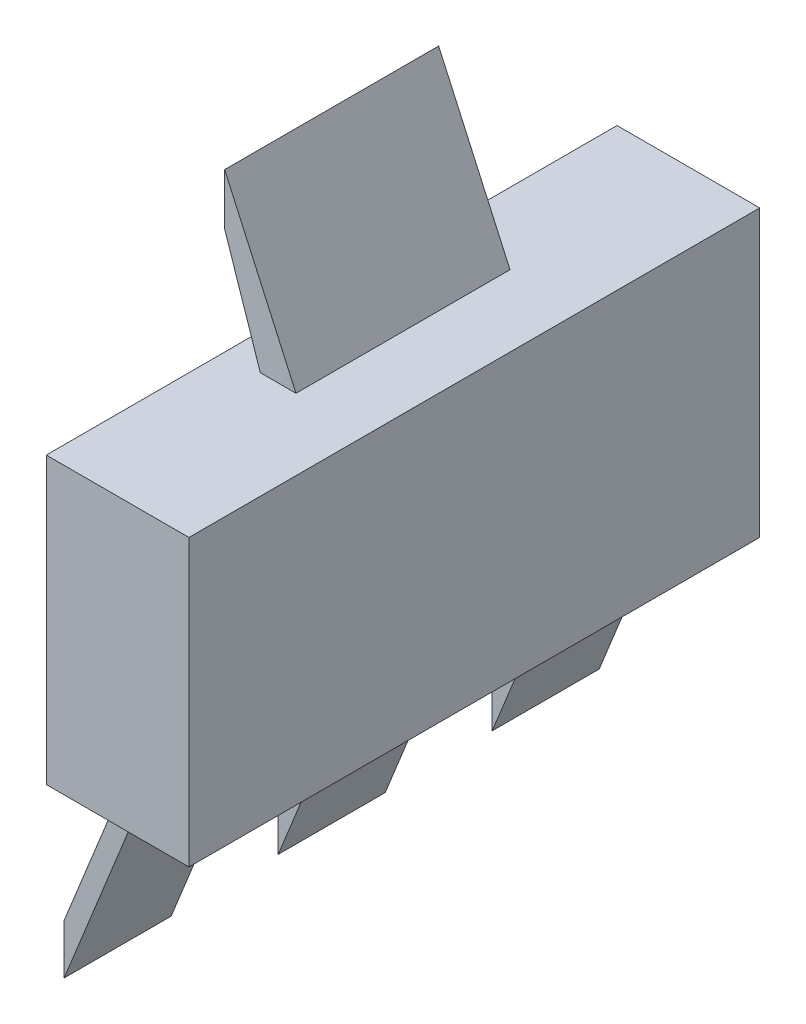
ISO-10303-21;
HEADER;
FILE_DESCRIPTION(('STEP AP214'),'2;1');
FILE_NAME('part.step','',(''),(''),'','','');
FILE_SCHEMA(('AUTOMOTIVE_DESIGN { 1 0 10303 214 1 1 1 1 }'));
ENDSEC;
DATA;
#1=APPLICATION_CONTEXT('core data for automotive mechanical design processes');
#2=APPLICATION_PROTOCOL_DEFINITION('international standard','automotive_design',2000,#1);
#3=PRODUCT_CONTEXT('',#1,'mechanical');
#4=PRODUCT('Part','Part','',(#3));
#5=PRODUCT_RELATED_PRODUCT_CATEGORY('part','',(#4));
#6=PRODUCT_DEFINITION_FORMATION('','',#4);
#7=PRODUCT_DEFINITION_CONTEXT('part definition',#1,'design');
#8=PRODUCT_DEFINITION('design','',#6,#7);
#9=PRODUCT_DEFINITION_SHAPE('','',#8);
#10=(LENGTH_UNIT() NAMED_UNIT(*) SI_UNIT(.MILLI.,.METRE.));
#11=(NAMED_UNIT(*) PLANE_ANGLE_UNIT() SI_UNIT($,.RADIAN.));
#12=(NAMED_UNIT(*) SI_UNIT($,.STERADIAN.) SOLID_ANGLE_UNIT());
#13=UNCERTAINTY_MEASURE_WITH_UNIT(LENGTH_MEASURE(1.E-05),#10,'distance_accuracy_value','');
#14=(GEOMETRIC_REPRESENTATION_CONTEXT(3) GLOBAL_UNCERTAINTY_ASSIGNED_CONTEXT((#13)) GLOBAL_UNIT_ASSIGNED_CONTEXT((#10,
#11,#12)) REPRESENTATION_CONTEXT('',''));
#15=CARTESIAN_POINT('',(0.,0.,0.));
#16=DIRECTION('',(0.,0.,1.));
#17=DIRECTION('',(1.,0.,0.));
#18=AXIS2_PLACEMENT_3D('',#15,#16,#17);
#19=CARTESIAN_POINT('',(2.,2.,4.));
#20=DIRECTION('',(0.,-1.,0.));
#21=DIRECTION('',(0.,0.,-1.));
#22=AXIS2_PLACEMENT_3D('',#19,#20,#21);
#23=PLANE('',#22);
#24=DIRECTION('',(0.,0.,1.));
#25=VECTOR('',#24,1.);
#26=CARTESIAN_POINT('',(0.,2.,4.));
#27=LINE('',#26,#25);
#28=CARTESIAN_POINT('',(0.,2.,-4.));
#29=VERTEX_POINT('',#28);
#30=CARTESIAN_POINT('',(0.,2.,4.));
#31=VERTEX_POINT('',#30);
#32=EDGE_CURVE('E309',#29,#31,#27,.T.);
#33=ORIENTED_EDGE('',*,*,#32,.T.);
#34=DIRECTION('',(-1.,0.,0.));
#35=VECTOR('',#34,1.);
#36=CARTESIAN_POINT('',(2.,2.,4.));
#37=LINE('',#36,#35);
#38=CARTESIAN_POINT('',(2.,2.,4.));
#39=VERTEX_POINT('',#38);
#40=EDGE_CURVE('E43',#39,#31,#37,.T.);
#41=ORIENTED_EDGE('',*,*,#40,.F.);
#42=DIRECTION('',(0.,0.,1.));
#43=VECTOR('',#42,1.);
#44=CARTESIAN_POINT('',(2.,2.,4.));
#45=LINE('',#44,#43);
#46=CARTESIAN_POINT('',(2.,2.,-4.));
#47=VERTEX_POINT('',#46);
#48=EDGE_CURVE('E299',#47,#39,#45,.T.);
#49=ORIENTED_EDGE('',*,*,#48,.F.);
#50=DIRECTION('',(-1.,0.,0.));
#51=VECTOR('',#50,1.);
#52=CARTESIAN_POINT('',(2.,2.,-4.));
#53=LINE('',#52,#51);
#54=EDGE_CURVE('E11',#47,#29,#53,.T.);
#55=ORIENTED_EDGE('',*,*,#54,.T.);
#56=EDGE_LOOP('',(#33,#41,#49,#55));
#57=FACE_BOUND('',#56,.T.);
#58=DIRECTION('',(1.,0.,0.));
#59=VECTOR('',#58,1.);
#60=CARTESIAN_POINT('',(0.5,2.,1.5));
#61=LINE('',#60,#59);
#62=CARTESIAN_POINT('',(0.5,2.,1.5));
#63=VERTEX_POINT('',#62);
#64=CARTESIAN_POINT('',(1.,2.,1.5));
#65=VERTEX_POINT('',#64);
#66=EDGE_CURVE('E267',#63,#65,#61,.T.);
#67=ORIENTED_EDGE('',*,*,#66,.F.);
#68=DIRECTION('',(0.,0.,-1.));
#69=VECTOR('',#68,1.);
#70=CARTESIAN_POINT('',(0.5,2.,1.5));
#71=LINE('',#70,#69);
#72=CARTESIAN_POINT('',(0.5,2.,-1.5));
#73=VERTEX_POINT('',#72);
#74=EDGE_CURVE('E277',#63,#73,#71,.T.);
#75=ORIENTED_EDGE('',*,*,#74,.T.);
#76=DIRECTION('',(1.,0.,0.));
#77=VECTOR('',#76,1.);
#78=CARTESIAN_POINT('',(0.5,2.,-1.5));
#79=LINE('',#78,#77);
#80=CARTESIAN_POINT('',(1.,2.,-1.5));
#81=VERTEX_POINT('',#80);
#82=EDGE_CURVE('E266',#73,#81,#79,.T.);
#83=ORIENTED_EDGE('',*,*,#82,.T.);
#84=DIRECTION('',(0.,0.,-1.));
#85=VECTOR('',#84,1.);
#86=CARTESIAN_POINT('',(1.,2.,1.5));
#87=LINE('',#86,#85);
#88=EDGE_CURVE('E293',#65,#81,#87,.T.);
#89=ORIENTED_EDGE('',*,*,#88,.F.);
#90=EDGE_LOOP('',(#67,#75,#83,#89));
#91=FACE_BOUND('',#90,.T.);
#92=ADVANCED_FACE('F35',(#57,#91),#23,.F.);
#93=CARTESIAN_POINT('',(2.,-2.,-4.));
#94=DIRECTION('',(0.,0.,1.));
#95=DIRECTION('',(1.,0.,0.));
#96=AXIS2_PLACEMENT_3D('',#93,#94,#95);
#97=PLANE('',#96);
#98=DIRECTION('',(0.,1.,0.));
#99=VECTOR('',#98,1.);
#100=CARTESIAN_POINT('',(0.,-2.,-4.));
#101=LINE('',#100,#99);
#102=CARTESIAN_POINT('',(0.,-2.,-4.));
#103=VERTEX_POINT('',#102);
#104=EDGE_CURVE('E295',#103,#29,#101,.T.);
#105=ORIENTED_EDGE('',*,*,#104,.T.);
#106=ORIENTED_EDGE('',*,*,#54,.F.);
#107=DIRECTION('',(0.,1.,0.));
#108=VECTOR('',#107,1.);
#109=CARTESIAN_POINT('',(2.,-2.,-4.));
#110=LINE('',#109,#108);
#111=CARTESIAN_POINT('',(2.,-2.,-4.));
#112=VERTEX_POINT('',#111);
#113=EDGE_CURVE('E296',#112,#47,#110,.T.);
#114=ORIENTED_EDGE('',*,*,#113,.F.);
#115=DIRECTION('',(-1.,0.,0.));
#116=VECTOR('',#115,1.);
#117=CARTESIAN_POINT('',(2.,-2.,-4.));
#118=LINE('',#117,#116);
#119=EDGE_CURVE('E306',#112,#103,#118,.T.);
#120=ORIENTED_EDGE('',*,*,#119,.T.);
#121=EDGE_LOOP('',(#105,#106,#114,#120));
#122=FACE_BOUND('',#121,.T.);
#123=ADVANCED_FACE('F37',(#122),#97,.F.);
#124=CARTESIAN_POINT('',(2.,-2.,4.));
#125=DIRECTION('',(0.,0.,-1.));
#126=DIRECTION('',(-1.,0.,0.));
#127=AXIS2_PLACEMENT_3D('',#124,#125,#126);
#128=PLANE('',#127);
#129=DIRECTION('',(0.,-1.,0.));
#130=VECTOR('',#129,1.);
#131=CARTESIAN_POINT('',(0.,-2.,4.));
#132=LINE('',#131,#130);
#133=CARTESIAN_POINT('',(0.,-2.,4.));
#134=VERTEX_POINT('',#133);
#135=EDGE_CURVE('E311',#31,#134,#132,.T.);
#136=ORIENTED_EDGE('',*,*,#135,.T.);
#137=DIRECTION('',(-1.,0.,0.));
#138=VECTOR('',#137,1.);
#139=CARTESIAN_POINT('',(2.,-2.,4.));
#140=LINE('',#139,#138);
#141=CARTESIAN_POINT('',(2.,-2.,4.));
#142=VERTEX_POINT('',#141);
#143=EDGE_CURVE('E316',#142,#134,#140,.T.);
#144=ORIENTED_EDGE('',*,*,#143,.F.);
#145=DIRECTION('',(0.,-1.,0.));
#146=VECTOR('',#145,1.);
#147=CARTESIAN_POINT('',(2.,-2.,4.));
#148=LINE('',#147,#146);
#149=EDGE_CURVE('E302',#39,#142,#148,.T.);
#150=ORIENTED_EDGE('',*,*,#149,.F.);
#151=ORIENTED_EDGE('',*,*,#40,.T.);
#152=EDGE_LOOP('',(#136,#144,#150,#151));
#153=FACE_BOUND('',#152,.T.);
#154=ADVANCED_FACE('F323',(#153),#128,.F.);
#155=CARTESIAN_POINT('',(2.,-2.,4.));
#156=DIRECTION('',(0.,1.,0.));
#157=DIRECTION('',(0.,0.,1.));
#158=AXIS2_PLACEMENT_3D('',#155,#156,#157);
#159=PLANE('',#158);
#160=DIRECTION('',(0.,0.,-1.));
#161=VECTOR('',#160,1.);
#162=CARTESIAN_POINT('',(0.717703757608056,-2.,3.75));
#163=LINE('',#162,#161);
#164=CARTESIAN_POINT('',(0.717703757608056,-2.,3.75));
#165=VERTEX_POINT('',#164);
#166=CARTESIAN_POINT('',(0.717703757608056,-2.,2.25));
#167=VERTEX_POINT('',#166);
#168=EDGE_CURVE('E50',#165,#167,#163,.T.);
#169=ORIENTED_EDGE('',*,*,#168,.F.);
#170=DIRECTION('',(-1.,0.,0.));
#171=VECTOR('',#170,1.);
#172=CARTESIAN_POINT('',(0.717703757608056,-2.,3.75));
#173=LINE('',#172,#171);
#174=CARTESIAN_POINT('',(1.,-2.,3.75));
#175=VERTEX_POINT('',#174);
#176=EDGE_CURVE('E55',#175,#165,#173,.T.);
#177=ORIENTED_EDGE('',*,*,#176,.F.);
#178=DIRECTION('',(0.,0.,-1.));
#179=VECTOR('',#178,1.);
#180=CARTESIAN_POINT('',(1.,-2.,3.75));
#181=LINE('',#180,#179);
#182=CARTESIAN_POINT('',(1.,-2.,2.25));
#183=VERTEX_POINT('',#182);
#184=EDGE_CURVE('E191',#175,#183,#181,.T.);
#185=ORIENTED_EDGE('',*,*,#184,.T.);
#186=DIRECTION('',(-1.,0.,0.));
#187=VECTOR('',#186,1.);
#188=CARTESIAN_POINT('',(0.717703757608056,-2.,2.25));
#189=LINE('',#188,#187);
#190=EDGE_CURVE('E195',#183,#167,#189,.T.);
#191=ORIENTED_EDGE('',*,*,#190,.T.);
#192=EDGE_LOOP('',(#169,#177,#185,#191));
#193=FACE_BOUND('',#192,.T.);
#194=DIRECTION('',(0.,0.,-1.));
#195=VECTOR('',#194,1.);
#196=CARTESIAN_POINT('',(0.717703757608056,-2.,-2.25));
#197=LINE('',#196,#195);
#198=CARTESIAN_POINT('',(0.717703757608056,-2.,-2.25));
#199=VERTEX_POINT('',#198);
#200=CARTESIAN_POINT('',(0.717703757608056,-2.,-3.75));
#201=VERTEX_POINT('',#200);
#202=EDGE_CURVE('E233',#199,#201,#197,.T.);
#203=ORIENTED_EDGE('',*,*,#202,.F.);
#204=DIRECTION('',(-1.,0.,0.));
#205=VECTOR('',#204,1.);
#206=CARTESIAN_POINT('',(0.717703757608056,-2.,-2.25));
#207=LINE('',#206,#205);
#208=CARTESIAN_POINT('',(1.,-2.,-2.25));
#209=VERTEX_POINT('',#208);
#210=EDGE_CURVE('E207',#209,#199,#207,.T.);
#211=ORIENTED_EDGE('',*,*,#210,.F.);
#212=DIRECTION('',(0.,0.,-1.));
#213=VECTOR('',#212,1.);
#214=CARTESIAN_POINT('',(1.,-2.,-2.25));
#215=LINE('',#214,#213);
#216=CARTESIAN_POINT('',(1.,-2.,-3.75));
#217=VERTEX_POINT('',#216);
#218=EDGE_CURVE('E218',#209,#217,#215,.T.);
#219=ORIENTED_EDGE('',*,*,#218,.T.);
#220=DIRECTION('',(-1.,0.,0.));
#221=VECTOR('',#220,1.);
#222=CARTESIAN_POINT('',(0.717703757608056,-2.,-3.75));
#223=LINE('',#222,#221);
#224=EDGE_CURVE('E206',#217,#201,#223,.T.);
#225=ORIENTED_EDGE('',*,*,#224,.T.);
#226=EDGE_LOOP('',(#203,#211,#219,#225));
#227=FACE_BOUND('',#226,.T.);
#228=DIRECTION('',(0.,0.,-1.));
#229=VECTOR('',#228,1.);
#230=CARTESIAN_POINT('',(0.717703757608056,-2.,0.75));
#231=LINE('',#230,#229);
#232=CARTESIAN_POINT('',(0.717703757608056,-2.,0.75));
#233=VERTEX_POINT('',#232);
#234=CARTESIAN_POINT('',(0.717703757608056,-2.,-0.75));
#235=VERTEX_POINT('',#234);
#236=EDGE_CURVE('E263',#233,#235,#231,.T.);
#237=ORIENTED_EDGE('',*,*,#236,.F.);
#238=DIRECTION('',(-1.,0.,0.));
#239=VECTOR('',#238,1.);
#240=CARTESIAN_POINT('',(0.717703757608056,-2.,0.75));
#241=LINE('',#240,#239);
#242=CARTESIAN_POINT('',(1.,-2.,0.75));
#243=VERTEX_POINT('',#242);
#244=EDGE_CURVE('E237',#243,#233,#241,.T.);
#245=ORIENTED_EDGE('',*,*,#244,.F.);
#246=DIRECTION('',(0.,0.,-1.));
#247=VECTOR('',#246,1.);
#248=CARTESIAN_POINT('',(1.,-2.,0.75));
#249=LINE('',#248,#247);
#250=CARTESIAN_POINT('',(1.,-2.,-0.75));
#251=VERTEX_POINT('',#250);
#252=EDGE_CURVE('E248',#243,#251,#249,.T.);
#253=ORIENTED_EDGE('',*,*,#252,.T.);
#254=DIRECTION('',(-1.,0.,0.));
#255=VECTOR('',#254,1.);
#256=CARTESIAN_POINT('',(0.717703757608056,-2.,-0.75));
#257=LINE('',#256,#255);
#258=EDGE_CURVE('E236',#251,#235,#257,.T.);
#259=ORIENTED_EDGE('',*,*,#258,.T.);
#260=EDGE_LOOP('',(#237,#245,#253,#259));
#261=FACE_BOUND('',#260,.T.);
#262=DIRECTION('',(0.,0.,-1.));
#263=VECTOR('',#262,1.);
#264=CARTESIAN_POINT('',(0.,-2.,4.));
#265=LINE('',#264,#263);
#266=EDGE_CURVE('E300',#134,#103,#265,.T.);
#267=ORIENTED_EDGE('',*,*,#266,.T.);
#268=ORIENTED_EDGE('',*,*,#119,.F.);
#269=DIRECTION('',(0.,0.,-1.));
#270=VECTOR('',#269,1.);
#271=CARTESIAN_POINT('',(2.,-2.,4.));
#272=LINE('',#271,#270);
#273=EDGE_CURVE('E304',#142,#112,#272,.T.);
#274=ORIENTED_EDGE('',*,*,#273,.F.);
#275=ORIENTED_EDGE('',*,*,#143,.T.);
#276=EDGE_LOOP('',(#267,#268,#274,#275));
#277=FACE_BOUND('',#276,.T.);
#278=ADVANCED_FACE('F332',(#193,#227,#261,#277),#159,.F.);
#279=CARTESIAN_POINT('',(2.,0.,0.));
#280=DIRECTION('',(-1.,0.,0.));
#281=DIRECTION('',(0.,0.,1.));
#282=AXIS2_PLACEMENT_3D('',#279,#280,#281);
#283=PLANE('',#282);
#284=ORIENTED_EDGE('',*,*,#113,.T.);
#285=ORIENTED_EDGE('',*,*,#48,.T.);
#286=ORIENTED_EDGE('',*,*,#149,.T.);
#287=ORIENTED_EDGE('',*,*,#273,.T.);
#288=EDGE_LOOP('',(#284,#285,#286,#287));
#289=FACE_BOUND('',#288,.T.);
#290=ADVANCED_FACE('F338',(#289),#283,.F.);
#291=CARTESIAN_POINT('',(0.,0.,0.));
#292=DIRECTION('',(-1.,0.,0.));
#293=DIRECTION('',(0.,0.,1.));
#294=AXIS2_PLACEMENT_3D('',#291,#292,#293);
#295=PLANE('',#294);
#296=ORIENTED_EDGE('',*,*,#104,.F.);
#297=ORIENTED_EDGE('',*,*,#266,.F.);
#298=ORIENTED_EDGE('',*,*,#135,.F.);
#299=ORIENTED_EDGE('',*,*,#32,.F.);
#300=EDGE_LOOP('',(#296,#297,#298,#299));
#301=FACE_BOUND('',#300,.T.);
#302=ADVANCED_FACE('F329',(#301),#295,.T.);
#303=CARTESIAN_POINT('',(1.,2.,1.5));
#304=DIRECTION('',(-0.91144973146294,-0.411411457079327,0.));
#305=DIRECTION('',(0.411411457079327,-0.91144973146294,0.));
#306=AXIS2_PLACEMENT_3D('',#303,#304,#305);
#307=PLANE('',#306);
#308=DIRECTION('',(-0.411411457079327,0.91144973146294,0.));
#309=VECTOR('',#308,1.);
#310=CARTESIAN_POINT('',(1.,2.,-1.5));
#311=LINE('',#310,#309);
#312=CARTESIAN_POINT('',(0.,4.21542136413376,-1.5));
#313=VERTEX_POINT('',#312);
#314=EDGE_CURVE('E280',#81,#313,#311,.T.);
#315=ORIENTED_EDGE('',*,*,#314,.T.);
#316=DIRECTION('',(0.,0.,-1.));
#317=VECTOR('',#316,1.);
#318=CARTESIAN_POINT('',(0.,4.21542136413376,1.5));
#319=LINE('',#318,#317);
#320=CARTESIAN_POINT('',(0.,4.21542136413376,1.5));
#321=VERTEX_POINT('',#320);
#322=EDGE_CURVE('E290',#321,#313,#319,.T.);
#323=ORIENTED_EDGE('',*,*,#322,.F.);
#324=DIRECTION('',(-0.411411457079327,0.91144973146294,0.));
#325=VECTOR('',#324,1.);
#326=CARTESIAN_POINT('',(1.,2.,1.5));
#327=LINE('',#326,#325);
#328=EDGE_CURVE('E270',#65,#321,#327,.T.);
#329=ORIENTED_EDGE('',*,*,#328,.F.);
#330=ORIENTED_EDGE('',*,*,#88,.T.);
#331=EDGE_LOOP('',(#315,#323,#329,#330));
#332=FACE_BOUND('',#331,.T.);
#333=ADVANCED_FACE('F359',(#332),#307,.F.);
#334=CARTESIAN_POINT('',(0.,4.21542136413376,1.5));
#335=DIRECTION('',(1.,0.,0.));
#336=DIRECTION('',(0.,0.,-1.));
#337=AXIS2_PLACEMENT_3D('',#334,#335,#336);
#338=PLANE('',#337);
#339=DIRECTION('',(0.,-1.,0.));
#340=VECTOR('',#339,1.);
#341=CARTESIAN_POINT('',(0.,4.21542136413376,-1.5));
#342=LINE('',#341,#340);
#343=CARTESIAN_POINT('',(0.,3.49328806013977,-1.5));
#344=VERTEX_POINT('',#343);
#345=EDGE_CURVE('E282',#313,#344,#342,.T.);
#346=ORIENTED_EDGE('',*,*,#345,.T.);
#347=DIRECTION('',(0.,0.,-1.));
#348=VECTOR('',#347,1.);
#349=CARTESIAN_POINT('',(0.,3.49328806013977,1.5));
#350=LINE('',#349,#348);
#351=CARTESIAN_POINT('',(0.,3.49328806013977,1.5));
#352=VERTEX_POINT('',#351);
#353=EDGE_CURVE('E287',#352,#344,#350,.T.);
#354=ORIENTED_EDGE('',*,*,#353,.F.);
#355=DIRECTION('',(0.,-1.,0.));
#356=VECTOR('',#355,1.);
#357=CARTESIAN_POINT('',(0.,4.21542136413376,1.5));
#358=LINE('',#357,#356);
#359=EDGE_CURVE('E273',#321,#352,#358,.T.);
#360=ORIENTED_EDGE('',*,*,#359,.F.);
#361=ORIENTED_EDGE('',*,*,#322,.T.);
#362=EDGE_LOOP('',(#346,#354,#360,#361));
#363=FACE_BOUND('',#362,.T.);
#364=ADVANCED_FACE('F361',(#363),#338,.F.);
#365=CARTESIAN_POINT('',(0.,3.49328806013977,1.5));
#366=DIRECTION('',(0.948256219951773,0.317506128008222,0.));
#367=DIRECTION('',(-0.317506128008222,0.948256219951774,0.));
#368=AXIS2_PLACEMENT_3D('',#365,#366,#367);
#369=PLANE('',#368);
#370=DIRECTION('',(0.317506128008222,-0.948256219951774,0.));
#371=VECTOR('',#370,1.);
#372=CARTESIAN_POINT('',(0.,3.49328806013977,-1.5));
#373=LINE('',#372,#371);
#374=EDGE_CURVE('E271',#344,#73,#373,.T.);
#375=ORIENTED_EDGE('',*,*,#374,.T.);
#376=ORIENTED_EDGE('',*,*,#74,.F.);
#377=DIRECTION('',(0.317506128008222,-0.948256219951774,0.));
#378=VECTOR('',#377,1.);
#379=CARTESIAN_POINT('',(0.,3.49328806013977,1.5));
#380=LINE('',#379,#378);
#381=EDGE_CURVE('E275',#352,#63,#380,.T.);
#382=ORIENTED_EDGE('',*,*,#381,.F.);
#383=ORIENTED_EDGE('',*,*,#353,.T.);
#384=EDGE_LOOP('',(#375,#376,#382,#383));
#385=FACE_BOUND('',#384,.T.);
#386=ADVANCED_FACE('F351',(#385),#369,.F.);
#387=CARTESIAN_POINT('',(0.,0.,1.5));
#388=DIRECTION('',(0.,0.,-1.));
#389=DIRECTION('',(-1.,0.,0.));
#390=AXIS2_PLACEMENT_3D('',#387,#388,#389);
#391=PLANE('',#390);
#392=ORIENTED_EDGE('',*,*,#66,.T.);
#393=ORIENTED_EDGE('',*,*,#328,.T.);
#394=ORIENTED_EDGE('',*,*,#359,.T.);
#395=ORIENTED_EDGE('',*,*,#381,.T.);
#396=EDGE_LOOP('',(#392,#393,#394,#395));
#397=FACE_BOUND('',#396,.T.);
#398=ADVANCED_FACE('F345',(#397),#391,.F.);
#399=CARTESIAN_POINT('',(0.,0.,-1.5));
#400=DIRECTION('',(0.,0.,-1.));
#401=DIRECTION('',(-1.,0.,0.));
#402=AXIS2_PLACEMENT_3D('',#399,#400,#401);
#403=PLANE('',#402);
#404=ORIENTED_EDGE('',*,*,#82,.F.);
#405=ORIENTED_EDGE('',*,*,#374,.F.);
#406=ORIENTED_EDGE('',*,*,#345,.F.);
#407=ORIENTED_EDGE('',*,*,#314,.F.);
#408=EDGE_LOOP('',(#404,#405,#406,#407));
#409=FACE_BOUND('',#408,.T.);
#410=ADVANCED_FACE('F357',(#409),#403,.T.);
#411=CARTESIAN_POINT('',(0.,-3.77481073040824,0.75));
#412=DIRECTION('',(0.927068845038582,-0.374891126273788,0.));
#413=DIRECTION('',(0.374891126273788,0.927068845038582,0.));
#414=AXIS2_PLACEMENT_3D('',#411,#412,#413);
#415=PLANE('',#414);
#416=DIRECTION('',(-0.374891126273788,-0.927068845038582,0.));
#417=VECTOR('',#416,1.);
#418=CARTESIAN_POINT('',(0.,-3.77481073040824,-0.75));
#419=LINE('',#418,#417);
#420=CARTESIAN_POINT('',(0.,-3.77481073040824,-0.75));
#421=VERTEX_POINT('',#420);
#422=EDGE_CURVE('E250',#235,#421,#419,.T.);
#423=ORIENTED_EDGE('',*,*,#422,.T.);
#424=DIRECTION('',(0.,0.,-1.));
#425=VECTOR('',#424,1.);
#426=CARTESIAN_POINT('',(0.,-3.77481073040824,0.75));
#427=LINE('',#426,#425);
#428=CARTESIAN_POINT('',(0.,-3.77481073040824,0.75));
#429=VERTEX_POINT('',#428);
#430=EDGE_CURVE('E260',#429,#421,#427,.T.);
#431=ORIENTED_EDGE('',*,*,#430,.F.);
#432=DIRECTION('',(-0.374891126273788,-0.927068845038582,0.));
#433=VECTOR('',#432,1.);
#434=CARTESIAN_POINT('',(0.,-3.77481073040824,0.75));
#435=LINE('',#434,#433);
#436=EDGE_CURVE('E240',#233,#429,#435,.T.);
#437=ORIENTED_EDGE('',*,*,#436,.F.);
#438=ORIENTED_EDGE('',*,*,#236,.T.);
#439=EDGE_LOOP('',(#423,#431,#437,#438));
#440=FACE_BOUND('',#439,.T.);
#441=ADVANCED_FACE('F425',(#440),#415,.F.);
#442=CARTESIAN_POINT('',(0.,-4.47290154411799,0.75));
#443=DIRECTION('',(1.,0.,0.));
#444=DIRECTION('',(0.,0.,-1.));
#445=AXIS2_PLACEMENT_3D('',#442,#443,#444);
#446=PLANE('',#445);
#447=DIRECTION('',(0.,-1.,0.));
#448=VECTOR('',#447,1.);
#449=CARTESIAN_POINT('',(0.,-4.47290154411799,-0.75));
#450=LINE('',#449,#448);
#451=CARTESIAN_POINT('',(0.,-4.47290154411799,-0.75));
#452=VERTEX_POINT('',#451);
#453=EDGE_CURVE('E252',#421,#452,#450,.T.);
#454=ORIENTED_EDGE('',*,*,#453,.T.);
#455=DIRECTION('',(0.,0.,-1.));
#456=VECTOR('',#455,1.);
#457=CARTESIAN_POINT('',(0.,-4.47290154411799,0.75));
#458=LINE('',#457,#456);
#459=CARTESIAN_POINT('',(0.,-4.47290154411799,0.75));
#460=VERTEX_POINT('',#459);
#461=EDGE_CURVE('E257',#460,#452,#458,.T.);
#462=ORIENTED_EDGE('',*,*,#461,.F.);
#463=DIRECTION('',(0.,-1.,0.));
#464=VECTOR('',#463,1.);
#465=CARTESIAN_POINT('',(0.,-4.47290154411799,0.75));
#466=LINE('',#465,#464);
#467=EDGE_CURVE('E243',#429,#460,#466,.T.);
#468=ORIENTED_EDGE('',*,*,#467,.F.);
#469=ORIENTED_EDGE('',*,*,#430,.T.);
#470=EDGE_LOOP('',(#454,#462,#468,#469));
#471=FACE_BOUND('',#470,.T.);
#472=ADVANCED_FACE('F433',(#471),#446,.F.);
#473=CARTESIAN_POINT('',(1.,-2.,0.75));
#474=DIRECTION('',(-0.927068845038582,0.374891126273788,0.));
#475=DIRECTION('',(-0.374891126273788,-0.927068845038582,0.));
#476=AXIS2_PLACEMENT_3D('',#473,#474,#475);
#477=PLANE('',#476);
#478=DIRECTION('',(0.374891126273788,0.927068845038582,0.));
#479=VECTOR('',#478,1.);
#480=CARTESIAN_POINT('',(1.,-2.,-0.75));
#481=LINE('',#480,#479);
#482=EDGE_CURVE('E241',#452,#251,#481,.T.);
#483=ORIENTED_EDGE('',*,*,#482,.T.);
#484=ORIENTED_EDGE('',*,*,#252,.F.);
#485=DIRECTION('',(0.374891126273788,0.927068845038582,0.));
#486=VECTOR('',#485,1.);
#487=CARTESIAN_POINT('',(1.,-2.,0.75));
#488=LINE('',#487,#486);
#489=EDGE_CURVE('E245',#460,#243,#488,.T.);
#490=ORIENTED_EDGE('',*,*,#489,.F.);
#491=ORIENTED_EDGE('',*,*,#461,.T.);
#492=EDGE_LOOP('',(#483,#484,#490,#491));
#493=FACE_BOUND('',#492,.T.);
#494=ADVANCED_FACE('F443',(#493),#477,.F.);
#495=CARTESIAN_POINT('',(0.,0.,0.75));
#496=DIRECTION('',(0.,0.,1.));
#497=DIRECTION('',(1.,0.,0.));
#498=AXIS2_PLACEMENT_3D('',#495,#496,#497);
#499=PLANE('',#498);
#500=ORIENTED_EDGE('',*,*,#244,.T.);
#501=ORIENTED_EDGE('',*,*,#436,.T.);
#502=ORIENTED_EDGE('',*,*,#467,.T.);
#503=ORIENTED_EDGE('',*,*,#489,.T.);
#504=EDGE_LOOP('',(#500,#501,#502,#503));
#505=FACE_BOUND('',#504,.T.);
#506=ADVANCED_FACE('F453',(#505),#499,.T.);
#507=CARTESIAN_POINT('',(0.,0.,-0.75));
#508=DIRECTION('',(0.,0.,1.));
#509=DIRECTION('',(1.,0.,0.));
#510=AXIS2_PLACEMENT_3D('',#507,#508,#509);
#511=PLANE('',#510);
#512=ORIENTED_EDGE('',*,*,#258,.F.);
#513=ORIENTED_EDGE('',*,*,#482,.F.);
#514=ORIENTED_EDGE('',*,*,#453,.F.);
#515=ORIENTED_EDGE('',*,*,#422,.F.);
#516=EDGE_LOOP('',(#512,#513,#514,#515));
#517=FACE_BOUND('',#516,.T.);
#518=ADVANCED_FACE('F463',(#517),#511,.F.);
#519=CARTESIAN_POINT('',(0.,-3.77481073040824,-2.25));
#520=DIRECTION('',(0.927068845038582,-0.374891126273788,0.));
#521=DIRECTION('',(0.374891126273788,0.927068845038582,0.));
#522=AXIS2_PLACEMENT_3D('',#519,#520,#521);
#523=PLANE('',#522);
#524=DIRECTION('',(-0.374891126273788,-0.927068845038582,0.));
#525=VECTOR('',#524,1.);
#526=CARTESIAN_POINT('',(0.,-3.77481073040824,-3.75));
#527=LINE('',#526,#525);
#528=CARTESIAN_POINT('',(0.,-3.77481073040824,-3.75));
#529=VERTEX_POINT('',#528);
#530=EDGE_CURVE('E220',#201,#529,#527,.T.);
#531=ORIENTED_EDGE('',*,*,#530,.T.);
#532=DIRECTION('',(0.,0.,-1.));
#533=VECTOR('',#532,1.);
#534=CARTESIAN_POINT('',(0.,-3.77481073040824,-2.25));
#535=LINE('',#534,#533);
#536=CARTESIAN_POINT('',(0.,-3.77481073040824,-2.25));
#537=VERTEX_POINT('',#536);
#538=EDGE_CURVE('E230',#537,#529,#535,.T.);
#539=ORIENTED_EDGE('',*,*,#538,.F.);
#540=DIRECTION('',(-0.374891126273788,-0.927068845038582,0.));
#541=VECTOR('',#540,1.);
#542=CARTESIAN_POINT('',(0.,-3.77481073040824,-2.25));
#543=LINE('',#542,#541);
#544=EDGE_CURVE('E210',#199,#537,#543,.T.);
#545=ORIENTED_EDGE('',*,*,#544,.F.);
#546=ORIENTED_EDGE('',*,*,#202,.T.);
#547=EDGE_LOOP('',(#531,#539,#545,#546));
#548=FACE_BOUND('',#547,.T.);
#549=ADVANCED_FACE('F473',(#548),#523,.F.);
#550=CARTESIAN_POINT('',(0.,-4.47290154411799,-2.25));
#551=DIRECTION('',(1.,0.,0.));
#552=DIRECTION('',(0.,0.,-1.));
#553=AXIS2_PLACEMENT_3D('',#550,#551,#552);
#554=PLANE('',#553);
#555=DIRECTION('',(0.,-1.,0.));
#556=VECTOR('',#555,1.);
#557=CARTESIAN_POINT('',(0.,-4.47290154411799,-3.75));
#558=LINE('',#557,#556);
#559=CARTESIAN_POINT('',(0.,-4.47290154411799,-3.75));
#560=VERTEX_POINT('',#559);
#561=EDGE_CURVE('E222',#529,#560,#558,.T.);
#562=ORIENTED_EDGE('',*,*,#561,.T.);
#563=DIRECTION('',(0.,0.,-1.));
#564=VECTOR('',#563,1.);
#565=CARTESIAN_POINT('',(0.,-4.47290154411799,-2.25));
#566=LINE('',#565,#564);
#567=CARTESIAN_POINT('',(0.,-4.47290154411799,-2.25));
#568=VERTEX_POINT('',#567);
#569=EDGE_CURVE('E227',#568,#560,#566,.T.);
#570=ORIENTED_EDGE('',*,*,#569,.F.);
#571=DIRECTION('',(0.,-1.,0.));
#572=VECTOR('',#571,1.);
#573=CARTESIAN_POINT('',(0.,-4.47290154411799,-2.25));
#574=LINE('',#573,#572);
#575=EDGE_CURVE('E213',#537,#568,#574,.T.);
#576=ORIENTED_EDGE('',*,*,#575,.F.);
#577=ORIENTED_EDGE('',*,*,#538,.T.);
#578=EDGE_LOOP('',(#562,#570,#576,#577));
#579=FACE_BOUND('',#578,.T.);
#580=ADVANCED_FACE('F491',(#579),#554,.F.);
#581=CARTESIAN_POINT('',(1.,-2.,-2.25));
#582=DIRECTION('',(-0.927068845038582,0.374891126273788,0.));
#583=DIRECTION('',(-0.374891126273788,-0.927068845038582,0.));
#584=AXIS2_PLACEMENT_3D('',#581,#582,#583);
#585=PLANE('',#584);
#586=DIRECTION('',(0.374891126273788,0.927068845038582,0.));
#587=VECTOR('',#586,1.);
#588=CARTESIAN_POINT('',(1.,-2.,-3.75));
#589=LINE('',#588,#587);
#590=EDGE_CURVE('E211',#560,#217,#589,.T.);
#591=ORIENTED_EDGE('',*,*,#590,.T.);
#592=ORIENTED_EDGE('',*,*,#218,.F.);
#593=DIRECTION('',(0.374891126273788,0.927068845038582,0.));
#594=VECTOR('',#593,1.);
#595=CARTESIAN_POINT('',(1.,-2.,-2.25));
#596=LINE('',#595,#594);
#597=EDGE_CURVE('E215',#568,#209,#596,.T.);
#598=ORIENTED_EDGE('',*,*,#597,.F.);
#599=ORIENTED_EDGE('',*,*,#569,.T.);
#600=EDGE_LOOP('',(#591,#592,#598,#599));
#601=FACE_BOUND('',#600,.T.);
#602=ADVANCED_FACE('F501',(#601),#585,.F.);
#603=CARTESIAN_POINT('',(0.,0.,-2.25));
#604=DIRECTION('',(0.,0.,1.));
#605=DIRECTION('',(1.,0.,0.));
#606=AXIS2_PLACEMENT_3D('',#603,#604,#605);
#607=PLANE('',#606);
#608=ORIENTED_EDGE('',*,*,#210,.T.);
#609=ORIENTED_EDGE('',*,*,#544,.T.);
#610=ORIENTED_EDGE('',*,*,#575,.T.);
#611=ORIENTED_EDGE('',*,*,#597,.T.);
#612=EDGE_LOOP('',(#608,#609,#610,#611));
#613=FACE_BOUND('',#612,.T.);
#614=ADVANCED_FACE('F511',(#613),#607,.T.);
#615=CARTESIAN_POINT('',(0.,0.,-3.75));
#616=DIRECTION('',(0.,0.,1.));
#617=DIRECTION('',(1.,0.,0.));
#618=AXIS2_PLACEMENT_3D('',#615,#616,#617);
#619=PLANE('',#618);
#620=ORIENTED_EDGE('',*,*,#224,.F.);
#621=ORIENTED_EDGE('',*,*,#590,.F.);
#622=ORIENTED_EDGE('',*,*,#561,.F.);
#623=ORIENTED_EDGE('',*,*,#530,.F.);
#624=EDGE_LOOP('',(#620,#621,#622,#623));
#625=FACE_BOUND('',#624,.T.);
#626=ADVANCED_FACE('F521',(#625),#619,.F.);
#627=CARTESIAN_POINT('',(0.,-3.77481073040824,3.75));
#628=DIRECTION('',(0.927068845038582,-0.374891126273788,0.));
#629=DIRECTION('',(0.374891126273788,0.927068845038582,0.));
#630=AXIS2_PLACEMENT_3D('',#627,#628,#629);
#631=PLANE('',#630);
#632=DIRECTION('',(-0.374891126273788,-0.927068845038582,0.));
#633=VECTOR('',#632,1.);
#634=CARTESIAN_POINT('',(0.,-3.77481073040824,2.25));
#635=LINE('',#634,#633);
#636=CARTESIAN_POINT('',(0.,-3.77481073040824,2.25));
#637=VERTEX_POINT('',#636);
#638=EDGE_CURVE('E181',#167,#637,#635,.T.);
#639=ORIENTED_EDGE('',*,*,#638,.T.);
#640=DIRECTION('',(0.,0.,-1.));
#641=VECTOR('',#640,1.);
#642=CARTESIAN_POINT('',(0.,-3.77481073040824,3.75));
#643=LINE('',#642,#641);
#644=CARTESIAN_POINT('',(0.,-3.77481073040824,3.75));
#645=VERTEX_POINT('',#644);
#646=EDGE_CURVE('E178',#645,#637,#643,.T.);
#647=ORIENTED_EDGE('',*,*,#646,.F.);
#648=DIRECTION('',(-0.374891126273788,-0.927068845038582,0.));
#649=VECTOR('',#648,1.);
#650=CARTESIAN_POINT('',(0.,-3.77481073040824,3.75));
#651=LINE('',#650,#649);
#652=EDGE_CURVE('E169',#165,#645,#651,.T.);
#653=ORIENTED_EDGE('',*,*,#652,.F.);
#654=ORIENTED_EDGE('',*,*,#168,.T.);
#655=EDGE_LOOP('',(#639,#647,#653,#654));
#656=FACE_BOUND('',#655,.T.);
#657=ADVANCED_FACE('F179',(#656),#631,.F.);
#658=CARTESIAN_POINT('',(0.,-4.47290154411799,3.75));
#659=DIRECTION('',(1.,0.,0.));
#660=DIRECTION('',(0.,0.,-1.));
#661=AXIS2_PLACEMENT_3D('',#658,#659,#660);
#662=PLANE('',#661);
#663=DIRECTION('',(0.,-1.,0.));
#664=VECTOR('',#663,1.);
#665=CARTESIAN_POINT('',(0.,-4.47290154411799,2.25));
#666=LINE('',#665,#664);
#667=CARTESIAN_POINT('',(0.,-4.47290154411799,2.25));
#668=VERTEX_POINT('',#667);
#669=EDGE_CURVE('E198',#637,#668,#666,.T.);
#670=ORIENTED_EDGE('',*,*,#669,.T.);
#671=DIRECTION('',(0.,0.,-1.));
#672=VECTOR('',#671,1.);
#673=CARTESIAN_POINT('',(0.,-4.47290154411799,3.75));
#674=LINE('',#673,#672);
#675=CARTESIAN_POINT('',(0.,-4.47290154411799,3.75));
#676=VERTEX_POINT('',#675);
#677=EDGE_CURVE('E184',#676,#668,#674,.T.);
#678=ORIENTED_EDGE('',*,*,#677,.F.);
#679=DIRECTION('',(0.,-1.,0.));
#680=VECTOR('',#679,1.);
#681=CARTESIAN_POINT('',(0.,-4.47290154411799,3.75));
#682=LINE('',#681,#680);
#683=EDGE_CURVE('E173',#645,#676,#682,.T.);
#684=ORIENTED_EDGE('',*,*,#683,.F.);
#685=ORIENTED_EDGE('',*,*,#646,.T.);
#686=EDGE_LOOP('',(#670,#678,#684,#685));
#687=FACE_BOUND('',#686,.T.);
#688=ADVANCED_FACE('F186',(#687),#662,.F.);
#689=CARTESIAN_POINT('',(1.,-2.,3.75));
#690=DIRECTION('',(-0.927068845038582,0.374891126273788,0.));
#691=DIRECTION('',(-0.374891126273788,-0.927068845038582,0.));
#692=AXIS2_PLACEMENT_3D('',#689,#690,#691);
#693=PLANE('',#692);
#694=DIRECTION('',(0.374891126273788,0.927068845038582,0.));
#695=VECTOR('',#694,1.);
#696=CARTESIAN_POINT('',(1.,-2.,2.25));
#697=LINE('',#696,#695);
#698=EDGE_CURVE('E200',#668,#183,#697,.T.);
#699=ORIENTED_EDGE('',*,*,#698,.T.);
#700=ORIENTED_EDGE('',*,*,#184,.F.);
#701=DIRECTION('',(0.374891126273788,0.927068845038582,0.));
#702=VECTOR('',#701,1.);
#703=CARTESIAN_POINT('',(1.,-2.,3.75));
#704=LINE('',#703,#702);
#705=EDGE_CURVE('E189',#676,#175,#704,.T.);
#706=ORIENTED_EDGE('',*,*,#705,.F.);
#707=ORIENTED_EDGE('',*,*,#677,.T.);
#708=EDGE_LOOP('',(#699,#700,#706,#707));
#709=FACE_BOUND('',#708,.T.);
#710=ADVANCED_FACE('F548',(#709),#693,.F.);
#711=CARTESIAN_POINT('',(0.,0.,3.75));
#712=DIRECTION('',(0.,0.,1.));
#713=DIRECTION('',(1.,0.,0.));
#714=AXIS2_PLACEMENT_3D('',#711,#712,#713);
#715=PLANE('',#714);
#716=ORIENTED_EDGE('',*,*,#176,.T.);
#717=ORIENTED_EDGE('',*,*,#652,.T.);
#718=ORIENTED_EDGE('',*,*,#683,.T.);
#719=ORIENTED_EDGE('',*,*,#705,.T.);
#720=EDGE_LOOP('',(#716,#717,#718,#719));
#721=FACE_BOUND('',#720,.T.);
#722=ADVANCED_FACE('F171',(#721),#715,.T.);
#723=CARTESIAN_POINT('',(0.,0.,2.25));
#724=DIRECTION('',(0.,0.,1.));
#725=DIRECTION('',(1.,0.,0.));
#726=AXIS2_PLACEMENT_3D('',#723,#724,#725);
#727=PLANE('',#726);
#728=ORIENTED_EDGE('',*,*,#190,.F.);
#729=ORIENTED_EDGE('',*,*,#698,.F.);
#730=ORIENTED_EDGE('',*,*,#669,.F.);
#731=ORIENTED_EDGE('',*,*,#638,.F.);
#732=EDGE_LOOP('',(#728,#729,#730,#731));
#733=FACE_BOUND('',#732,.T.);
#734=ADVANCED_FACE('F566',(#733),#727,.F.);
#735=CLOSED_SHELL('',(#92,#123,#154,#278,#290,#302,#333,#364,#386,#398,#410,#441,#472,#494,#506,
#518,#549,#580,#602,#614,#626,#657,#688,#710,#722,#734));
#736=MANIFOLD_SOLID_BREP('B2',#735);
#737=ADVANCED_BREP_SHAPE_REPRESENTATION('',(#18,#736),#14);
#738=SHAPE_DEFINITION_REPRESENTATION(#9,#737);
ENDSEC;
END-ISO-10303-21;
